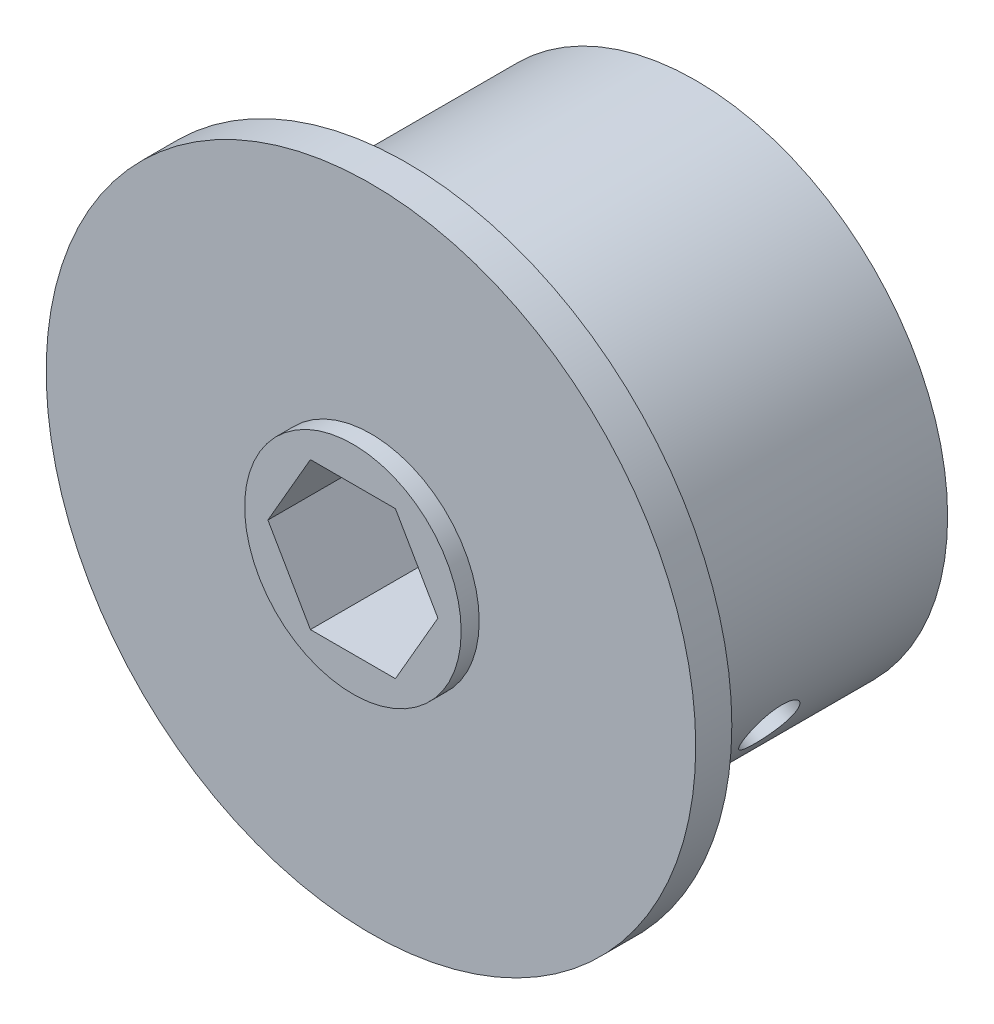
ISO-10303-21;
HEADER;
FILE_DESCRIPTION(('STEP AP214'),'2;1');
FILE_NAME('part.step','',(''),(''),'','','');
FILE_SCHEMA(('AUTOMOTIVE_DESIGN { 1 0 10303 214 1 1 1 1 }'));
ENDSEC;
DATA;
#1=APPLICATION_CONTEXT('core data for automotive mechanical design processes');
#2=APPLICATION_PROTOCOL_DEFINITION('international standard','automotive_design',2000,#1);
#3=PRODUCT_CONTEXT('',#1,'mechanical');
#4=PRODUCT('Part','Part','',(#3));
#5=PRODUCT_RELATED_PRODUCT_CATEGORY('part','',(#4));
#6=PRODUCT_DEFINITION_FORMATION('','',#4);
#7=PRODUCT_DEFINITION_CONTEXT('part definition',#1,'design');
#8=PRODUCT_DEFINITION('design','',#6,#7);
#9=PRODUCT_DEFINITION_SHAPE('','',#8);
#10=(LENGTH_UNIT() NAMED_UNIT(*) SI_UNIT(.MILLI.,.METRE.));
#11=(NAMED_UNIT(*) PLANE_ANGLE_UNIT() SI_UNIT($,.RADIAN.));
#12=(NAMED_UNIT(*) SI_UNIT($,.STERADIAN.) SOLID_ANGLE_UNIT());
#13=UNCERTAINTY_MEASURE_WITH_UNIT(LENGTH_MEASURE(1.E-05),#10,'distance_accuracy_value','');
#14=(GEOMETRIC_REPRESENTATION_CONTEXT(3) GLOBAL_UNCERTAINTY_ASSIGNED_CONTEXT((#13)) GLOBAL_UNIT_ASSIGNED_CONTEXT((#10,
#11,#12)) REPRESENTATION_CONTEXT('',''));
#15=CARTESIAN_POINT('',(0.,0.,0.));
#16=DIRECTION('',(0.,0.,1.));
#17=DIRECTION('',(1.,0.,0.));
#18=AXIS2_PLACEMENT_3D('',#15,#16,#17);
#19=CARTESIAN_POINT('',(0.,0.,15.875));
#20=DIRECTION('',(0.,0.,1.));
#21=DIRECTION('',(1.,0.,0.));
#22=AXIS2_PLACEMENT_3D('',#19,#20,#21);
#23=PLANE('',#22);
#24=CARTESIAN_POINT('',(0.,0.,15.875));
#25=DIRECTION('',(0.,0.,1.));
#26=DIRECTION('',(1.,0.,0.));
#27=AXIS2_PLACEMENT_3D('',#24,#25,#26);
#28=CIRCLE('',#27,28.575);
#29=CARTESIAN_POINT('',(28.575,0.,15.875));
#30=VERTEX_POINT('',#29);
#31=EDGE_CURVE('E159',#30,#30,#28,.T.);
#32=ORIENTED_EDGE('',*,*,#31,.T.);
#33=EDGE_LOOP('',(#32));
#34=FACE_BOUND('',#33,.T.);
#35=CARTESIAN_POINT('',(0.,0.,15.875));
#36=DIRECTION('',(0.,0.,1.));
#37=DIRECTION('',(1.,0.,0.));
#38=AXIS2_PLACEMENT_3D('',#35,#36,#37);
#39=CIRCLE('',#38,9.525);
#40=CARTESIAN_POINT('',(9.525,0.,15.875));
#41=VERTEX_POINT('',#40);
#42=EDGE_CURVE('E146',#41,#41,#39,.T.);
#43=ORIENTED_EDGE('',*,*,#42,.F.);
#44=EDGE_LOOP('',(#43));
#45=FACE_BOUND('',#44,.T.);
#46=ADVANCED_FACE('F45',(#34,#45),#23,.T.);
#47=CARTESIAN_POINT('',(0.,0.,12.7));
#48=DIRECTION('',(0.,0.,-1.));
#49=DIRECTION('',(-1.,0.,0.));
#50=AXIS2_PLACEMENT_3D('',#47,#48,#49);
#51=CYLINDRICAL_SURFACE('',#50,22.1615);
#52=CARTESIAN_POINT('',(-17.8718158307409,13.1045900798948,0.));
#53=CARTESIAN_POINT('',(-17.871820224846,13.1045858973804,0.135107549877782));
#54=CARTESIAN_POINT('',(-17.8785966118391,13.0953580559295,0.270302822316726));
#55=CARTESIAN_POINT('',(-17.9054350823029,13.0586359921838,0.536940361540157));
#56=CARTESIAN_POINT('',(-17.925511556838,13.0311219836436,0.668378402017896));
#57=CARTESIAN_POINT('',(-17.9780890483062,12.9584873362586,0.923601833752717));
#58=CARTESIAN_POINT('',(-18.0105822359077,12.9133777918696,1.0473919903435));
#59=CARTESIAN_POINT('',(-18.0866482871833,12.8066198281334,1.28390635191414));
#60=CARTESIAN_POINT('',(-18.1302190517812,12.744974542001,1.39663264776811));
#61=CARTESIAN_POINT('',(-18.2269004230544,12.6063211337034,1.60832770286021));
#62=CARTESIAN_POINT('',(-18.2800467920555,12.5292552963364,1.70724233332941));
#63=CARTESIAN_POINT('',(-18.3937344749281,12.3617490344331,1.88803961510108));
#64=CARTESIAN_POINT('',(-18.4542761364789,12.2713079810378,1.969921465142));
#65=CARTESIAN_POINT('',(-18.5806953560517,12.079035251207,2.11451866753716));
#66=CARTESIAN_POINT('',(-18.6465858477198,11.9771757236898,2.17718569964955));
#67=CARTESIAN_POINT('',(-18.7812587703655,11.7648708656253,2.28126514399162));
#68=CARTESIAN_POINT('',(-18.8500411186744,11.6544257804351,2.32267816335873));
#69=CARTESIAN_POINT('',(-18.9879404504429,11.4283704133736,2.38291412633372));
#70=CARTESIAN_POINT('',(-19.0570550088438,11.3127824636263,2.40182641504861));
#71=CARTESIAN_POINT('',(-19.1937628328722,11.0792532508907,2.41680066372596));
#72=CARTESIAN_POINT('',(-19.2613561446291,10.9613120594662,2.41286331750833));
#73=CARTESIAN_POINT('',(-19.3928372798855,10.7269718737099,2.3823222819212));
#74=CARTESIAN_POINT('',(-19.4567395858153,10.6105684631306,2.3558146695425));
#75=CARTESIAN_POINT('',(-19.5795492739872,10.3822036514942,2.28103540042261));
#76=CARTESIAN_POINT('',(-19.6384565811452,10.2702423172232,2.2327634165917));
#77=CARTESIAN_POINT('',(-19.7501005172439,10.0538787914519,2.11572137603471));
#78=CARTESIAN_POINT('',(-19.8028241264533,9.94949271963546,2.04690911407633));
#79=CARTESIAN_POINT('',(-19.9009660072967,9.75170973158794,1.89077050611883));
#80=CARTESIAN_POINT('',(-19.9463840246077,9.65831319795614,1.80344351582841));
#81=CARTESIAN_POINT('',(-20.0294021553203,9.48495843366156,1.61221473089836));
#82=CARTESIAN_POINT('',(-20.0669604916729,9.40507242658334,1.50822930545273));
#83=CARTESIAN_POINT('',(-20.1334441963845,9.26189818819076,1.28692448490394));
#84=CARTESIAN_POINT('',(-20.1623695480892,9.19860998889578,1.16960506407835));
#85=CARTESIAN_POINT('',(-20.2112510284752,9.09070630640858,0.924895031489563));
#86=CARTESIAN_POINT('',(-20.2312047004873,9.04609593790138,0.797501672446385));
#87=CARTESIAN_POINT('',(-20.2619188416526,8.97709120619611,0.536293961694688));
#88=CARTESIAN_POINT('',(-20.272679644183,8.95269610989702,0.40247984301936));
#89=CARTESIAN_POINT('',(-20.2848718006579,8.92503724088286,0.132963039345574));
#90=CARTESIAN_POINT('',(-20.2863506674362,8.92166585154537,-0.00272645838644722));
#91=CARTESIAN_POINT('',(-20.2800915852448,8.93588414825553,-0.272786213180352));
#92=CARTESIAN_POINT('',(-20.2723537844022,8.95347349742916,-0.407156491409298));
#93=CARTESIAN_POINT('',(-20.2477672412533,9.00893505841533,-0.670419468304693));
#94=CARTESIAN_POINT('',(-20.230941455606,9.04675616160307,-0.799325089854127));
#95=CARTESIAN_POINT('',(-20.1883643859492,9.14137305250932,-1.04840214166004));
#96=CARTESIAN_POINT('',(-20.1626128609769,9.19816935248866,-1.16857333601232));
#97=CARTESIAN_POINT('',(-20.1023511356681,9.32913491108898,-1.39730210235461));
#98=CARTESIAN_POINT('',(-20.0678060732033,9.40337322647373,-1.50581094492649));
#99=CARTESIAN_POINT('',(-19.9904551269609,9.56670949950874,-1.7076396845117));
#100=CARTESIAN_POINT('',(-19.9476490003849,9.65580789389695,-1.80095913494923));
#101=CARTESIAN_POINT('',(-19.8542241961788,9.84647964026446,-1.97016589899839));
#102=CARTESIAN_POINT('',(-19.8035727988573,9.94810485691146,-2.04597673171678));
#103=CARTESIAN_POINT('',(-19.6955081441473,10.1603742915641,-2.17748702631499));
#104=CARTESIAN_POINT('',(-19.6380949941923,10.271018366266,-2.2331868076701));
#105=CARTESIAN_POINT('',(-19.5178497746033,10.4977157885511,-2.32276537992922));
#106=CARTESIAN_POINT('',(-19.4550293258044,10.6137573012658,-2.35668970317208));
#107=CARTESIAN_POINT('',(-19.3253957058265,10.8479985301571,-2.40190282519144));
#108=CARTESIAN_POINT('',(-19.2585826692569,10.9661981734795,-2.41319238665199));
#109=CARTESIAN_POINT('',(-19.123144810793,11.2006988831251,-2.41280363936898));
#110=CARTESIAN_POINT('',(-19.0545311436458,11.3170066062795,-2.40124379081666));
#111=CARTESIAN_POINT('',(-18.9172048600835,11.545092900631,-2.35573359220399));
#112=CARTESIAN_POINT('',(-18.8484922436332,11.6568714702153,-2.32178323417059));
#113=CARTESIAN_POINT('',(-18.7131833395852,11.8728726077814,-2.23249006021187));
#114=CARTESIAN_POINT('',(-18.6465866378331,11.9770966596136,-2.17715145893857));
#115=CARTESIAN_POINT('',(-18.5177558412525,12.1753354561273,-2.04666506564997));
#116=CARTESIAN_POINT('',(-18.4555217468058,12.2693501999157,-1.97151727190178));
#117=CARTESIAN_POINT('',(-18.337340641937,12.4452933685969,-1.80310303595968));
#118=CARTESIAN_POINT('',(-18.2814264446352,12.5271593474157,-1.70974832716643));
#119=CARTESIAN_POINT('',(-18.1783404761937,12.6762873432931,-1.50774865998014));
#120=CARTESIAN_POINT('',(-18.1311707961315,12.7435458679271,-1.39910005525543));
#121=CARTESIAN_POINT('',(-18.0473245224273,12.8620161378904,-1.1692369717526));
#122=CARTESIAN_POINT('',(-18.0106794664028,12.9131796965381,-1.04798617820925));
#123=CARTESIAN_POINT('',(-17.9496145143314,12.9979296180732,-0.796695678988488));
#124=CARTESIAN_POINT('',(-17.9251809921214,13.0315355744092,-0.666665954031007));
#125=CARTESIAN_POINT('',(-17.8955773692263,13.0721371319264,-0.446600006434227));
#126=CARTESIAN_POINT('',(-17.8866840115806,13.0842928641542,-0.357964940148138));
#127=CARTESIAN_POINT('',(-17.874801797439,13.1005207070254,-0.179566163665263));
#128=CARTESIAN_POINT('',(-17.871812910094,13.1045928599029,-0.0898024593677152));
#129=CARTESIAN_POINT('',(-17.8718158307409,13.1045900798948,0.));
#130=B_SPLINE_CURVE_WITH_KNOTS('',3,(#52,#53,#54,#55,#56,#57,#58,#59,#60,#61,#62,#63,#64,#65,
#66,#67,#68,#69,#70,#71,#72,#73,#74,#75,#76,#77,#78,#79,#80,#81,#82,#83,#84,#85,#86,#87,#88,#89,
#90,#91,#92,#93,#94,#95,#96,#97,#98,#99,#100,#101,#102,#103,#104,#105,#106,#107,#108,#109,#110,
#111,#112,#113,#114,#115,#116,#117,#118,#119,#120,#121,#122,#123,#124,#125,#126,#127,#128,#129),
.UNSPECIFIED.,.T.,.F.,(4,2,2,2,2,2,2,2,2,2,2,2,2,2,2,2,2,2,2,2,2,2,2,2,2,2,2,2,2,2,2,2,2,2,2,2,
2,2,4),(0.,0.4049946688639,0.810428270531388,1.21560664763094,1.62070830514336,2.02735551202382,
2.43402184420944,2.84170260350582,3.24937171643548,3.65541661036258,4.06144917496549,
4.46576193389737,4.87008076931807,5.27523616750482,5.68040566694918,6.087676957091,
6.49494903290765,6.90233256214509,7.30970131708985,7.71498310036299,8.12025837017013,
8.52451465181874,8.92878184778895,9.33467743188275,9.74058494735677,10.1482333511529,
10.5558752789414,10.9626620293076,11.3694350726605,11.7741047778957,12.1787746272298,
12.5833647751253,12.987954958414,13.3945576582678,13.8012574640118,14.2091635475721,
14.6166134497753,14.8858042340675,15.1549936119201),.UNSPECIFIED.);
#131=CARTESIAN_POINT('',(-17.8718158307409,13.1045900798948,0.));
#132=VERTEX_POINT('',#131);
#133=EDGE_CURVE('E257',#132,#132,#130,.T.);
#134=ORIENTED_EDGE('',*,*,#133,.T.);
#135=EDGE_LOOP('',(#134));
#136=FACE_BOUND('',#135,.T.);
#137=CARTESIAN_POINT('',(17.8718158307409,-13.1045900798948,0.));
#138=CARTESIAN_POINT('',(17.8718202248461,-13.1045858973804,0.135107549877782));
#139=CARTESIAN_POINT('',(17.8785966118392,-13.0953580559295,0.270302822316726));
#140=CARTESIAN_POINT('',(17.9054350823029,-13.0586359921838,0.536940361540157));
#141=CARTESIAN_POINT('',(17.925511556838,-13.0311219836436,0.668378402017897));
#142=CARTESIAN_POINT('',(17.9780890483062,-12.9584873362586,0.923601833752718));
#143=CARTESIAN_POINT('',(18.0105822359078,-12.9133777918696,1.0473919903435));
#144=CARTESIAN_POINT('',(18.0866482871833,-12.8066198281333,1.28390635191414));
#145=CARTESIAN_POINT('',(18.1302190517813,-12.744974542001,1.39663264776811));
#146=CARTESIAN_POINT('',(18.2269004230544,-12.6063211337034,1.60832770286021));
#147=CARTESIAN_POINT('',(18.2800467920555,-12.5292552963364,1.70724233332941));
#148=CARTESIAN_POINT('',(18.3937344749281,-12.3617490344331,1.88803961510108));
#149=CARTESIAN_POINT('',(18.4542761364789,-12.2713079810378,1.969921465142));
#150=CARTESIAN_POINT('',(18.5806953560517,-12.079035251207,2.11451866753716));
#151=CARTESIAN_POINT('',(18.6465858477198,-11.9771757236897,2.17718569964955));
#152=CARTESIAN_POINT('',(18.7812587703655,-11.7648708656253,2.28126514399162));
#153=CARTESIAN_POINT('',(18.8500411186744,-11.6544257804351,2.32267816335873));
#154=CARTESIAN_POINT('',(18.9879404504429,-11.4283704133736,2.38291412633372));
#155=CARTESIAN_POINT('',(19.0570550088438,-11.3127824636262,2.40182641504861));
#156=CARTESIAN_POINT('',(19.1937628328722,-11.0792532508907,2.41680066372596));
#157=CARTESIAN_POINT('',(19.2613561446292,-10.9613120594661,2.41286331750833));
#158=CARTESIAN_POINT('',(19.3928372798855,-10.7269718737099,2.3823222819212));
#159=CARTESIAN_POINT('',(19.4567395858153,-10.6105684631306,2.3558146695425));
#160=CARTESIAN_POINT('',(19.5795492739872,-10.3822036514942,2.28103540042261));
#161=CARTESIAN_POINT('',(19.6384565811452,-10.2702423172232,2.2327634165917));
#162=CARTESIAN_POINT('',(19.7501005172439,-10.0538787914519,2.11572137603471));
#163=CARTESIAN_POINT('',(19.8028241264533,-9.94949271963543,2.04690911407633));
#164=CARTESIAN_POINT('',(19.9009660072967,-9.75170973158791,1.89077050611883));
#165=CARTESIAN_POINT('',(19.9463840246077,-9.65831319795611,1.80344351582841));
#166=CARTESIAN_POINT('',(20.0294021553203,-9.48495843366153,1.61221473089836));
#167=CARTESIAN_POINT('',(20.0669604916729,-9.40507242658332,1.50822930545273));
#168=CARTESIAN_POINT('',(20.1334441963845,-9.26189818819074,1.28692448490394));
#169=CARTESIAN_POINT('',(20.1623695480892,-9.19860998889576,1.16960506407835));
#170=CARTESIAN_POINT('',(20.2112510284752,-9.09070630640855,0.924895031489562));
#171=CARTESIAN_POINT('',(20.2312047004873,-9.04609593790135,0.797501672446385));
#172=CARTESIAN_POINT('',(20.2619188416526,-8.97709120619608,0.536293961694689));
#173=CARTESIAN_POINT('',(20.272679644183,-8.952696109897,0.40247984301936));
#174=CARTESIAN_POINT('',(20.2848718006579,-8.92503724088283,0.132963039345573));
#175=CARTESIAN_POINT('',(20.2863506674362,-8.92166585154535,-0.00272645838644782));
#176=CARTESIAN_POINT('',(20.2800915852448,-8.9358841482555,-0.272786213180353));
#177=CARTESIAN_POINT('',(20.2723537844022,-8.95347349742914,-0.4071564914093));
#178=CARTESIAN_POINT('',(20.2477672412534,-9.0089350584153,-0.670419468304695));
#179=CARTESIAN_POINT('',(20.230941455606,-9.04675616160305,-0.799325089854128));
#180=CARTESIAN_POINT('',(20.1883643859492,-9.1413730525093,-1.04840214166004));
#181=CARTESIAN_POINT('',(20.1626128609769,-9.19816935248864,-1.16857333601232));
#182=CARTESIAN_POINT('',(20.1023511356681,-9.32913491108896,-1.39730210235461));
#183=CARTESIAN_POINT('',(20.0678060732033,-9.4033732264737,-1.5058109449265));
#184=CARTESIAN_POINT('',(19.990455126961,-9.56670949950872,-1.7076396845117));
#185=CARTESIAN_POINT('',(19.9476490003849,-9.65580789389693,-1.80095913494923));
#186=CARTESIAN_POINT('',(19.8542241961788,-9.84647964026444,-1.97016589899839));
#187=CARTESIAN_POINT('',(19.8035727988573,-9.94810485691144,-2.04597673171678));
#188=CARTESIAN_POINT('',(19.6955081441473,-10.1603742915641,-2.17748702631499));
#189=CARTESIAN_POINT('',(19.6380949941923,-10.271018366266,-2.23318680767011));
#190=CARTESIAN_POINT('',(19.5178497746033,-10.497715788551,-2.32276537992922));
#191=CARTESIAN_POINT('',(19.4550293258044,-10.6137573012657,-2.35668970317208));
#192=CARTESIAN_POINT('',(19.3253957058265,-10.8479985301571,-2.40190282519144));
#193=CARTESIAN_POINT('',(19.2585826692569,-10.9661981734795,-2.41319238665199));
#194=CARTESIAN_POINT('',(19.1231448107931,-11.2006988831251,-2.41280363936898));
#195=CARTESIAN_POINT('',(19.0545311436458,-11.3170066062794,-2.40124379081666));
#196=CARTESIAN_POINT('',(18.9172048600835,-11.5450929006309,-2.35573359220399));
#197=CARTESIAN_POINT('',(18.8484922436332,-11.6568714702153,-2.32178323417059));
#198=CARTESIAN_POINT('',(18.7131833395852,-11.8728726077814,-2.23249006021187));
#199=CARTESIAN_POINT('',(18.6465866378331,-11.9770966596136,-2.17715145893856));
#200=CARTESIAN_POINT('',(18.5177558412525,-12.1753354561273,-2.04666506564996));
#201=CARTESIAN_POINT('',(18.4555217468058,-12.2693501999157,-1.97151727190178));
#202=CARTESIAN_POINT('',(18.337340641937,-12.4452933685969,-1.80310303595968));
#203=CARTESIAN_POINT('',(18.2814264446353,-12.5271593474157,-1.70974832716642));
#204=CARTESIAN_POINT('',(18.1783404761937,-12.6762873432931,-1.50774865998014));
#205=CARTESIAN_POINT('',(18.1311707961315,-12.7435458679271,-1.39910005525543));
#206=CARTESIAN_POINT('',(18.0473245224273,-12.8620161378904,-1.1692369717526));
#207=CARTESIAN_POINT('',(18.0106794664028,-12.9131796965381,-1.04798617820925));
#208=CARTESIAN_POINT('',(17.9496145143314,-12.9979296180732,-0.796695678988487));
#209=CARTESIAN_POINT('',(17.9251809921214,-13.0315355744092,-0.666665954031006));
#210=CARTESIAN_POINT('',(17.8955773692263,-13.0721371319264,-0.446600006434226));
#211=CARTESIAN_POINT('',(17.8866840115806,-13.0842928641542,-0.357964940148137));
#212=CARTESIAN_POINT('',(17.874801797439,-13.1005207070254,-0.179566163665262));
#213=CARTESIAN_POINT('',(17.871812910094,-13.1045928599029,-0.0898024593677147));
#214=CARTESIAN_POINT('',(17.8718158307409,-13.1045900798948,0.));
#215=B_SPLINE_CURVE_WITH_KNOTS('',3,(#137,#138,#139,#140,#141,#142,#143,#144,#145,#146,#147,
#148,#149,#150,#151,#152,#153,#154,#155,#156,#157,#158,#159,#160,#161,#162,#163,#164,#165,#166,
#167,#168,#169,#170,#171,#172,#173,#174,#175,#176,#177,#178,#179,#180,#181,#182,#183,#184,#185,
#186,#187,#188,#189,#190,#191,#192,#193,#194,#195,#196,#197,#198,#199,#200,#201,#202,#203,#204,
#205,#206,#207,#208,#209,#210,#211,#212,#213,#214),.UNSPECIFIED.,.T.,.F.,(4,2,2,2,2,2,2,2,2,2,2,
2,2,2,2,2,2,2,2,2,2,2,2,2,2,2,2,2,2,2,2,2,2,2,2,2,2,2,4),(0.,0.4049946688639,0.810428270531389,
1.21560664763095,1.62070830514336,2.02735551202382,2.43402184420944,2.84170260350582,
3.24937171643548,3.65541661036258,4.06144917496549,4.46576193389738,4.87008076931807,
5.27523616750482,5.68040566694918,6.08767695709101,6.49494903290765,6.90233256214509,
7.30970131708985,7.71498310036299,8.12025837017013,8.52451465181874,8.92878184778896,
9.33467743188276,9.74058494735677,10.1482333511529,10.5558752789414,10.9626620293076,
11.3694350726605,11.7741047778957,12.1787746272298,12.5833647751253,12.987954958414,
13.3945576582678,13.8012574640118,14.2091635475721,14.6166134497753,14.8858042340675,
15.1549936119201),.UNSPECIFIED.);
#216=CARTESIAN_POINT('',(17.8718158307409,-13.1045900798948,0.));
#217=VERTEX_POINT('',#216);
#218=EDGE_CURVE('E252',#217,#217,#215,.T.);
#219=ORIENTED_EDGE('',*,*,#218,.T.);
#220=EDGE_LOOP('',(#219));
#221=FACE_BOUND('',#220,.T.);
#222=CARTESIAN_POINT('',(0.,0.,12.7));
#223=DIRECTION('',(0.,0.,1.));
#224=DIRECTION('',(1.,0.,0.));
#225=AXIS2_PLACEMENT_3D('',#222,#223,#224);
#226=CIRCLE('',#225,22.1615);
#227=CARTESIAN_POINT('',(22.1615,0.,12.7));
#228=VERTEX_POINT('',#227);
#229=EDGE_CURVE('E11',#228,#228,#226,.T.);
#230=ORIENTED_EDGE('',*,*,#229,.F.);
#231=EDGE_LOOP('',(#230));
#232=FACE_BOUND('',#231,.T.);
#233=CARTESIAN_POINT('',(0.,0.,-12.7));
#234=DIRECTION('',(0.,0.,-1.));
#235=DIRECTION('',(-1.,0.,0.));
#236=AXIS2_PLACEMENT_3D('',#233,#234,#235);
#237=CIRCLE('',#236,22.1615);
#238=CARTESIAN_POINT('',(-22.1615,0.,-12.7));
#239=VERTEX_POINT('',#238);
#240=EDGE_CURVE('E151',#239,#239,#237,.T.);
#241=ORIENTED_EDGE('',*,*,#240,.F.);
#242=EDGE_LOOP('',(#241));
#243=FACE_BOUND('',#242,.T.);
#244=ADVANCED_FACE('F47',(#136,#221,#232,#243),#51,.T.);
#245=CARTESIAN_POINT('',(0.,0.,12.7));
#246=DIRECTION('',(0.,0.,1.));
#247=DIRECTION('',(1.,0.,0.));
#248=AXIS2_PLACEMENT_3D('',#245,#246,#247);
#249=PLANE('',#248);
#250=ORIENTED_EDGE('',*,*,#229,.T.);
#251=EDGE_LOOP('',(#250));
#252=FACE_BOUND('',#251,.T.);
#253=CARTESIAN_POINT('',(0.,0.,12.7));
#254=DIRECTION('',(0.,0.,1.));
#255=DIRECTION('',(1.,0.,0.));
#256=AXIS2_PLACEMENT_3D('',#253,#254,#255);
#257=CIRCLE('',#256,28.575);
#258=CARTESIAN_POINT('',(28.575,0.,12.7));
#259=VERTEX_POINT('',#258);
#260=EDGE_CURVE('E158',#259,#259,#257,.T.);
#261=ORIENTED_EDGE('',*,*,#260,.F.);
#262=EDGE_LOOP('',(#261));
#263=FACE_BOUND('',#262,.T.);
#264=ADVANCED_FACE('F221',(#252,#263),#249,.F.);
#265=CARTESIAN_POINT('',(0.,0.,15.875));
#266=DIRECTION('',(0.,0.,-1.));
#267=DIRECTION('',(-1.,0.,0.));
#268=AXIS2_PLACEMENT_3D('',#265,#266,#267);
#269=CYLINDRICAL_SURFACE('',#268,28.575);
#270=ORIENTED_EDGE('',*,*,#31,.F.);
#271=EDGE_LOOP('',(#270));
#272=FACE_BOUND('',#271,.T.);
#273=ORIENTED_EDGE('',*,*,#260,.T.);
#274=EDGE_LOOP('',(#273));
#275=FACE_BOUND('',#274,.T.);
#276=ADVANCED_FACE('F229',(#272,#275),#269,.T.);
#277=CARTESIAN_POINT('',(0.,0.,-12.7));
#278=DIRECTION('',(0.,0.,-1.));
#279=DIRECTION('',(-1.,0.,0.));
#280=AXIS2_PLACEMENT_3D('',#277,#278,#279);
#281=PLANE('',#280);
#282=CARTESIAN_POINT('',(0.,0.,-12.7));
#283=DIRECTION('',(0.,0.,-1.));
#284=DIRECTION('',(-1.,0.,0.));
#285=AXIS2_PLACEMENT_3D('',#282,#283,#284);
#286=CIRCLE('',#285,3.175);
#287=CARTESIAN_POINT('',(3.175,0.,-12.7));
#288=VERTEX_POINT('',#287);
#289=EDGE_CURVE('E50',#288,#288,#286,.T.);
#290=ORIENTED_EDGE('',*,*,#289,.F.);
#291=EDGE_LOOP('',(#290));
#292=FACE_BOUND('',#291,.T.);
#293=ORIENTED_EDGE('',*,*,#240,.T.);
#294=EDGE_LOOP('',(#293));
#295=FACE_BOUND('',#294,.T.);
#296=ADVANCED_FACE('F232',(#292,#295),#281,.T.);
#297=CARTESIAN_POINT('',(0.,0.,17.4625));
#298=DIRECTION('',(0.,0.,1.));
#299=DIRECTION('',(1.,0.,0.));
#300=AXIS2_PLACEMENT_3D('',#297,#298,#299);
#301=PLANE('',#300);
#302=CARTESIAN_POINT('',(0.,0.,17.4625));
#303=DIRECTION('',(0.,0.,1.));
#304=DIRECTION('',(1.,0.,0.));
#305=AXIS2_PLACEMENT_3D('',#302,#303,#304);
#306=CIRCLE('',#305,9.525);
#307=CARTESIAN_POINT('',(9.525,0.,17.4625));
#308=VERTEX_POINT('',#307);
#309=EDGE_CURVE('E147',#308,#308,#306,.T.);
#310=ORIENTED_EDGE('',*,*,#309,.T.);
#311=EDGE_LOOP('',(#310));
#312=FACE_BOUND('',#311,.T.);
#313=DIRECTION('',(-0.5,0.866025403784439,0.));
#314=VECTOR('',#313,1.);
#315=CARTESIAN_POINT('',(7.47899538708241,0.,17.4625));
#316=LINE('',#315,#314);
#317=CARTESIAN_POINT('',(7.47899538708241,0.,17.4625));
#318=VERTEX_POINT('',#317);
#319=CARTESIAN_POINT('',(3.73949769354121,6.477,17.4625));
#320=VERTEX_POINT('',#319);
#321=EDGE_CURVE('E108',#318,#320,#316,.T.);
#322=ORIENTED_EDGE('',*,*,#321,.F.);
#323=DIRECTION('',(0.5,0.866025403784439,0.));
#324=VECTOR('',#323,1.);
#325=CARTESIAN_POINT('',(3.73949769354121,-6.477,17.4625));
#326=LINE('',#325,#324);
#327=CARTESIAN_POINT('',(3.73949769354121,-6.477,17.4625));
#328=VERTEX_POINT('',#327);
#329=EDGE_CURVE('E118',#328,#318,#326,.T.);
#330=ORIENTED_EDGE('',*,*,#329,.F.);
#331=DIRECTION('',(1.,0.,0.));
#332=VECTOR('',#331,1.);
#333=CARTESIAN_POINT('',(-3.7394976935412,-6.477,17.4625));
#334=LINE('',#333,#332);
#335=CARTESIAN_POINT('',(-3.7394976935412,-6.477,17.4625));
#336=VERTEX_POINT('',#335);
#337=EDGE_CURVE('E143',#336,#328,#334,.T.);
#338=ORIENTED_EDGE('',*,*,#337,.F.);
#339=DIRECTION('',(0.5,-0.866025403784438,0.));
#340=VECTOR('',#339,1.);
#341=CARTESIAN_POINT('',(-7.47899538708241,0.,17.4625));
#342=LINE('',#341,#340);
#343=CARTESIAN_POINT('',(-7.47899538708241,0.,17.4625));
#344=VERTEX_POINT('',#343);
#345=EDGE_CURVE('E140',#344,#336,#342,.T.);
#346=ORIENTED_EDGE('',*,*,#345,.F.);
#347=DIRECTION('',(-0.5,-0.866025403784439,0.));
#348=VECTOR('',#347,1.);
#349=CARTESIAN_POINT('',(-3.73949769354121,6.477,17.4625));
#350=LINE('',#349,#348);
#351=CARTESIAN_POINT('',(-3.73949769354121,6.477,17.4625));
#352=VERTEX_POINT('',#351);
#353=EDGE_CURVE('E133',#352,#344,#350,.T.);
#354=ORIENTED_EDGE('',*,*,#353,.F.);
#355=DIRECTION('',(-1.,0.,0.));
#356=VECTOR('',#355,1.);
#357=CARTESIAN_POINT('',(3.73949769354121,6.477,17.4625));
#358=LINE('',#357,#356);
#359=EDGE_CURVE('E129',#320,#352,#358,.T.);
#360=ORIENTED_EDGE('',*,*,#359,.F.);
#361=EDGE_LOOP('',(#322,#330,#338,#346,#354,#360));
#362=FACE_BOUND('',#361,.T.);
#363=ADVANCED_FACE('F126',(#312,#362),#301,.T.);
#364=CARTESIAN_POINT('',(0.,0.,17.4625));
#365=DIRECTION('',(0.,0.,-1.));
#366=DIRECTION('',(-1.,0.,0.));
#367=AXIS2_PLACEMENT_3D('',#364,#365,#366);
#368=CYLINDRICAL_SURFACE('',#367,9.525);
#369=ORIENTED_EDGE('',*,*,#309,.F.);
#370=EDGE_LOOP('',(#369));
#371=FACE_BOUND('',#370,.T.);
#372=ORIENTED_EDGE('',*,*,#42,.T.);
#373=EDGE_LOOP('',(#372));
#374=FACE_BOUND('',#373,.T.);
#375=ADVANCED_FACE('F239',(#371,#374),#368,.T.);
#376=CARTESIAN_POINT('',(0.,0.,0.));
#377=DIRECTION('',(0.,0.,-1.));
#378=DIRECTION('',(-1.,0.,0.));
#379=AXIS2_PLACEMENT_3D('',#376,#377,#378);
#380=PLANE('',#379);
#381=CARTESIAN_POINT('',(0.,0.,0.));
#382=DIRECTION('',(0.,0.,1.));
#383=DIRECTION('',(1.,0.,0.));
#384=AXIS2_PLACEMENT_3D('',#381,#382,#383);
#385=CIRCLE('',#384,3.175);
#386=CARTESIAN_POINT('',(3.175,0.,0.));
#387=VERTEX_POINT('',#386);
#388=EDGE_CURVE('E249',#387,#387,#385,.T.);
#389=ORIENTED_EDGE('',*,*,#388,.F.);
#390=EDGE_LOOP('',(#389));
#391=FACE_BOUND('',#390,.T.);
#392=DIRECTION('',(1.,0.,0.));
#393=VECTOR('',#392,1.);
#394=CARTESIAN_POINT('',(-3.73949769354121,-6.47700000000001,0.));
#395=LINE('',#394,#393);
#396=CARTESIAN_POINT('',(-3.73949769354121,-6.47700000000001,0.));
#397=VERTEX_POINT('',#396);
#398=CARTESIAN_POINT('',(3.73949769354121,-6.47700000000001,0.));
#399=VERTEX_POINT('',#398);
#400=EDGE_CURVE('E179',#397,#399,#395,.T.);
#401=ORIENTED_EDGE('',*,*,#400,.T.);
#402=DIRECTION('',(0.5,0.866025403784439,0.));
#403=VECTOR('',#402,1.);
#404=CARTESIAN_POINT('',(3.73949769354121,-6.47700000000001,0.));
#405=LINE('',#404,#403);
#406=CARTESIAN_POINT('',(7.47899538708241,0.,0.));
#407=VERTEX_POINT('',#406);
#408=EDGE_CURVE('E163',#399,#407,#405,.T.);
#409=ORIENTED_EDGE('',*,*,#408,.T.);
#410=DIRECTION('',(-0.5,0.866025403784439,0.));
#411=VECTOR('',#410,1.);
#412=CARTESIAN_POINT('',(7.47899538708241,0.,0.));
#413=LINE('',#412,#411);
#414=CARTESIAN_POINT('',(3.7394976935412,6.47700000000001,0.));
#415=VERTEX_POINT('',#414);
#416=EDGE_CURVE('E111',#407,#415,#413,.T.);
#417=ORIENTED_EDGE('',*,*,#416,.T.);
#418=DIRECTION('',(-1.,0.,0.));
#419=VECTOR('',#418,1.);
#420=CARTESIAN_POINT('',(3.7394976935412,6.47700000000001,0.));
#421=LINE('',#420,#419);
#422=CARTESIAN_POINT('',(-3.73949769354121,6.47700000000001,0.));
#423=VERTEX_POINT('',#422);
#424=EDGE_CURVE('E171',#415,#423,#421,.T.);
#425=ORIENTED_EDGE('',*,*,#424,.T.);
#426=DIRECTION('',(-0.5,-0.866025403784439,0.));
#427=VECTOR('',#426,1.);
#428=CARTESIAN_POINT('',(-3.73949769354121,6.47700000000001,0.));
#429=LINE('',#428,#427);
#430=CARTESIAN_POINT('',(-7.47899538708242,0.,0.));
#431=VERTEX_POINT('',#430);
#432=EDGE_CURVE('E71',#423,#431,#429,.T.);
#433=ORIENTED_EDGE('',*,*,#432,.T.);
#434=DIRECTION('',(0.5,-0.866025403784439,0.));
#435=VECTOR('',#434,1.);
#436=CARTESIAN_POINT('',(-7.47899538708242,0.,0.));
#437=LINE('',#436,#435);
#438=EDGE_CURVE('E176',#431,#397,#437,.T.);
#439=ORIENTED_EDGE('',*,*,#438,.T.);
#440=EDGE_LOOP('',(#401,#409,#417,#425,#433,#439));
#441=FACE_BOUND('',#440,.T.);
#442=ADVANCED_FACE('F197',(#391,#441),#380,.F.);
#443=CARTESIAN_POINT('',(-3.73949769354121,-6.47700000000001,12.7));
#444=DIRECTION('',(0.,1.,0.));
#445=DIRECTION('',(0.,0.,1.));
#446=AXIS2_PLACEMENT_3D('',#443,#444,#445);
#447=PLANE('',#446);
#448=ORIENTED_EDGE('',*,*,#400,.F.);
#449=DIRECTION('',(0.,0.,-1.));
#450=VECTOR('',#449,1.);
#451=CARTESIAN_POINT('',(-3.73949769354121,-6.47700000000001,12.7));
#452=LINE('',#451,#450);
#453=EDGE_CURVE('E63',#336,#397,#452,.T.);
#454=ORIENTED_EDGE('',*,*,#453,.F.);
#455=ORIENTED_EDGE('',*,*,#337,.T.);
#456=DIRECTION('',(0.,0.,-1.));
#457=VECTOR('',#456,1.);
#458=CARTESIAN_POINT('',(3.73949769354121,-6.47700000000001,12.7));
#459=LINE('',#458,#457);
#460=EDGE_CURVE('E120',#328,#399,#459,.T.);
#461=ORIENTED_EDGE('',*,*,#460,.T.);
#462=EDGE_LOOP('',(#448,#454,#455,#461));
#463=FACE_BOUND('',#462,.T.);
#464=ADVANCED_FACE('F199',(#463),#447,.T.);
#465=CARTESIAN_POINT('',(-7.47899538708242,0.,12.7));
#466=DIRECTION('',(0.866025403784439,0.5,0.));
#467=DIRECTION('',(-0.5,0.866025403784439,0.));
#468=AXIS2_PLACEMENT_3D('',#465,#466,#467);
#469=PLANE('',#468);
#470=ORIENTED_EDGE('',*,*,#438,.F.);
#471=DIRECTION('',(0.,0.,-1.));
#472=VECTOR('',#471,1.);
#473=CARTESIAN_POINT('',(-7.47899538708242,0.,12.7));
#474=LINE('',#473,#472);
#475=EDGE_CURVE('E187',#344,#431,#474,.T.);
#476=ORIENTED_EDGE('',*,*,#475,.F.);
#477=ORIENTED_EDGE('',*,*,#345,.T.);
#478=ORIENTED_EDGE('',*,*,#453,.T.);
#479=EDGE_LOOP('',(#470,#476,#477,#478));
#480=FACE_BOUND('',#479,.T.);
#481=ADVANCED_FACE('F201',(#480),#469,.T.);
#482=CARTESIAN_POINT('',(-3.73949769354121,6.47700000000001,12.7));
#483=DIRECTION('',(0.866025403784439,-0.5,0.));
#484=DIRECTION('',(0.5,0.866025403784439,0.));
#485=AXIS2_PLACEMENT_3D('',#482,#483,#484);
#486=PLANE('',#485);
#487=ORIENTED_EDGE('',*,*,#475,.T.);
#488=ORIENTED_EDGE('',*,*,#432,.F.);
#489=DIRECTION('',(0.,0.,-1.));
#490=VECTOR('',#489,1.);
#491=CARTESIAN_POINT('',(-3.73949769354121,6.47700000000001,12.7));
#492=LINE('',#491,#490);
#493=EDGE_CURVE('E190',#352,#423,#492,.T.);
#494=ORIENTED_EDGE('',*,*,#493,.F.);
#495=ORIENTED_EDGE('',*,*,#353,.T.);
#496=EDGE_LOOP('',(#487,#488,#494,#495));
#497=FACE_BOUND('',#496,.T.);
#498=ADVANCED_FACE('F203',(#497),#486,.T.);
#499=CARTESIAN_POINT('',(3.7394976935412,6.47700000000001,12.7));
#500=DIRECTION('',(0.,-1.,0.));
#501=DIRECTION('',(1.,0.,0.));
#502=AXIS2_PLACEMENT_3D('',#499,#500,#501);
#503=PLANE('',#502);
#504=ORIENTED_EDGE('',*,*,#424,.F.);
#505=DIRECTION('',(0.,0.,-1.));
#506=VECTOR('',#505,1.);
#507=CARTESIAN_POINT('',(3.7394976935412,6.47700000000001,12.7));
#508=LINE('',#507,#506);
#509=EDGE_CURVE('E115',#320,#415,#508,.T.);
#510=ORIENTED_EDGE('',*,*,#509,.F.);
#511=ORIENTED_EDGE('',*,*,#359,.T.);
#512=ORIENTED_EDGE('',*,*,#493,.T.);
#513=EDGE_LOOP('',(#504,#510,#511,#512));
#514=FACE_BOUND('',#513,.T.);
#515=ADVANCED_FACE('F196',(#514),#503,.T.);
#516=CARTESIAN_POINT('',(7.47899538708241,0.,12.7));
#517=DIRECTION('',(-0.866025403784439,-0.5,0.));
#518=DIRECTION('',(0.5,-0.866025403784439,0.));
#519=AXIS2_PLACEMENT_3D('',#516,#517,#518);
#520=PLANE('',#519);
#521=ORIENTED_EDGE('',*,*,#416,.F.);
#522=DIRECTION('',(0.,0.,-1.));
#523=VECTOR('',#522,1.);
#524=CARTESIAN_POINT('',(7.47899538708241,0.,12.7));
#525=LINE('',#524,#523);
#526=EDGE_CURVE('E56',#318,#407,#525,.T.);
#527=ORIENTED_EDGE('',*,*,#526,.F.);
#528=ORIENTED_EDGE('',*,*,#321,.T.);
#529=ORIENTED_EDGE('',*,*,#509,.T.);
#530=EDGE_LOOP('',(#521,#527,#528,#529));
#531=FACE_BOUND('',#530,.T.);
#532=ADVANCED_FACE('F106',(#531),#520,.T.);
#533=CARTESIAN_POINT('',(3.73949769354121,-6.47700000000001,12.7));
#534=DIRECTION('',(-0.866025403784439,0.5,0.));
#535=DIRECTION('',(-0.5,-0.866025403784439,0.));
#536=AXIS2_PLACEMENT_3D('',#533,#534,#535);
#537=PLANE('',#536);
#538=ORIENTED_EDGE('',*,*,#526,.T.);
#539=ORIENTED_EDGE('',*,*,#408,.F.);
#540=ORIENTED_EDGE('',*,*,#460,.F.);
#541=ORIENTED_EDGE('',*,*,#329,.T.);
#542=EDGE_LOOP('',(#538,#539,#540,#541));
#543=FACE_BOUND('',#542,.T.);
#544=ADVANCED_FACE('F119',(#543),#537,.T.);
#545=CARTESIAN_POINT('',(0.,0.,-17.78));
#546=DIRECTION('',(0.,0.,1.));
#547=DIRECTION('',(1.,0.,0.));
#548=AXIS2_PLACEMENT_3D('',#545,#546,#547);
#549=CYLINDRICAL_SURFACE('',#548,3.175);
#550=CARTESIAN_POINT('',(3.175,0.,-12.7));
#551=CARTESIAN_POINT('',(3.175,0.,-12.5677083333333));
#552=CARTESIAN_POINT('',(3.175,0.,-12.4354166666667));
#553=CARTESIAN_POINT('',(3.175,0.,-12.1708333333333));
#554=CARTESIAN_POINT('',(3.175,0.,-12.0385416666667));
#555=CARTESIAN_POINT('',(3.175,0.,-11.7739583333333));
#556=CARTESIAN_POINT('',(3.175,0.,-11.6416666666667));
#557=CARTESIAN_POINT('',(3.175,0.,-11.3770833333333));
#558=CARTESIAN_POINT('',(3.175,0.,-11.2447916666667));
#559=CARTESIAN_POINT('',(3.175,0.,-10.9802083333333));
#560=CARTESIAN_POINT('',(3.175,0.,-10.8479166666667));
#561=CARTESIAN_POINT('',(3.175,0.,-10.5833333333333));
#562=CARTESIAN_POINT('',(3.175,0.,-10.4510416666667));
#563=CARTESIAN_POINT('',(3.175,0.,-10.1864583333333));
#564=CARTESIAN_POINT('',(3.175,0.,-10.0541666666667));
#565=CARTESIAN_POINT('',(3.175,0.,-9.78958333333333));
#566=CARTESIAN_POINT('',(3.175,0.,-9.65729166666666));
#567=CARTESIAN_POINT('',(3.175,0.,-9.39270833333333));
#568=CARTESIAN_POINT('',(3.175,0.,-9.26041666666666));
#569=CARTESIAN_POINT('',(3.175,0.,-8.99583333333333));
#570=CARTESIAN_POINT('',(3.175,0.,-8.86354166666666));
#571=CARTESIAN_POINT('',(3.175,0.,-8.59895833333333));
#572=CARTESIAN_POINT('',(3.175,0.,-8.46666666666667));
#573=CARTESIAN_POINT('',(3.175,0.,-8.20208333333333));
#574=CARTESIAN_POINT('',(3.175,0.,-8.06979166666667));
#575=CARTESIAN_POINT('',(3.175,0.,-7.80520833333333));
#576=CARTESIAN_POINT('',(3.175,0.,-7.67291666666667));
#577=CARTESIAN_POINT('',(3.175,0.,-7.40833333333333));
#578=CARTESIAN_POINT('',(3.175,0.,-7.27604166666667));
#579=CARTESIAN_POINT('',(3.175,0.,-7.01145833333333));
#580=CARTESIAN_POINT('',(3.175,0.,-6.87916666666666));
#581=CARTESIAN_POINT('',(3.175,0.,-6.61458333333333));
#582=CARTESIAN_POINT('',(3.175,0.,-6.48229166666667));
#583=CARTESIAN_POINT('',(3.175,0.,-6.21770833333333));
#584=CARTESIAN_POINT('',(3.175,0.,-6.08541666666667));
#585=CARTESIAN_POINT('',(3.175,0.,-5.82083333333333));
#586=CARTESIAN_POINT('',(3.175,0.,-5.68854166666667));
#587=CARTESIAN_POINT('',(3.175,0.,-5.42395833333333));
#588=CARTESIAN_POINT('',(3.175,0.,-5.29166666666667));
#589=CARTESIAN_POINT('',(3.175,0.,-5.02708333333333));
#590=CARTESIAN_POINT('',(3.175,0.,-4.89479166666667));
#591=CARTESIAN_POINT('',(3.175,0.,-4.63020833333333));
#592=CARTESIAN_POINT('',(3.175,0.,-4.49791666666667));
#593=CARTESIAN_POINT('',(3.175,0.,-4.23333333333333));
#594=CARTESIAN_POINT('',(3.175,0.,-4.10104166666667));
#595=CARTESIAN_POINT('',(3.175,0.,-3.83645833333333));
#596=CARTESIAN_POINT('',(3.175,0.,-3.70416666666667));
#597=CARTESIAN_POINT('',(3.175,0.,-3.43958333333333));
#598=CARTESIAN_POINT('',(3.175,0.,-3.30729166666667));
#599=CARTESIAN_POINT('',(3.175,0.,-3.04270833333333));
#600=CARTESIAN_POINT('',(3.175,0.,-2.91041666666667));
#601=CARTESIAN_POINT('',(3.175,0.,-2.64583333333333));
#602=CARTESIAN_POINT('',(3.175,0.,-2.51354166666667));
#603=CARTESIAN_POINT('',(3.175,0.,-2.24895833333333));
#604=CARTESIAN_POINT('',(3.175,0.,-2.11666666666667));
#605=CARTESIAN_POINT('',(3.175,0.,-1.85208333333333));
#606=CARTESIAN_POINT('',(3.175,0.,-1.71979166666667));
#607=CARTESIAN_POINT('',(3.175,0.,-1.45520833333333));
#608=CARTESIAN_POINT('',(3.175,0.,-1.32291666666667));
#609=CARTESIAN_POINT('',(3.175,0.,-1.05833333333333));
#610=CARTESIAN_POINT('',(3.175,0.,-0.926041666666666));
#611=CARTESIAN_POINT('',(3.175,0.,-0.661458333333332));
#612=CARTESIAN_POINT('',(3.175,0.,-0.529166666666665));
#613=CARTESIAN_POINT('',(3.175,0.,-0.264583333333332));
#614=CARTESIAN_POINT('',(3.175,0.,-0.132291666666666));
#615=CARTESIAN_POINT('',(3.175,0.,0.));
#616=B_SPLINE_CURVE_WITH_KNOTS('',3,(#550,#551,#552,#553,#554,#555,#556,#557,#558,#559,#560,
#561,#562,#563,#564,#565,#566,#567,#568,#569,#570,#571,#572,#573,#574,#575,#576,#577,#578,#579,
#580,#581,#582,#583,#584,#585,#586,#587,#588,#589,#590,#591,#592,#593,#594,#595,#596,#597,#598,
#599,#600,#601,#602,#603,#604,#605,#606,#607,#608,#609,#610,#611,#612,#613,#614,#615),
.UNSPECIFIED.,.F.,.F.,(4,2,2,2,2,2,2,2,2,2,2,2,2,2,2,2,2,2,2,2,2,2,2,2,2,2,2,2,2,2,2,2,4),(0.,
0.396875000000001,0.793750000000001,1.190625,1.5875,1.984375,2.38125,2.778125,3.175,3.571875,
3.96875,4.365625,4.7625,5.159375,5.55625,5.953125,6.35,6.746875,7.14375,7.540625,7.9375,
8.334375,8.73125,9.128125,9.525,9.921875,10.31875,10.715625,11.1125,11.509375,11.90625,
12.303125,12.7),.UNSPECIFIED.);
#617=EDGE_CURVE('BSEAM274',#288,#387,#616,.T.);
#618=ORIENTED_EDGE('',*,*,#289,.T.);
#619=ORIENTED_EDGE('',*,*,#388,.T.);
#620=ORIENTED_EDGE('',*,*,#617,.T.);
#621=ORIENTED_EDGE('',*,*,#617,.F.);
#622=EDGE_LOOP('',(#618,#620,#619,#621));
#623=FACE_BOUND('',#622,.T.);
#624=ADVANCED_FACE('F274',(#623),#549,.F.);
#625=CARTESIAN_POINT('',(24.0867645554566,-13.9065,0.));
#626=DIRECTION('',(-0.866025403784439,0.5,0.));
#627=DIRECTION('',(-0.5,-0.866025403784439,0.));
#628=AXIS2_PLACEMENT_3D('',#625,#626,#627);
#629=CYLINDRICAL_SURFACE('',#628,2.413);
#630=CARTESIAN_POINT('',(11.108507854343,-6.4135,0.));
#631=DIRECTION('',(0.866025403784439,-0.5,0.));
#632=DIRECTION('',(0.5,0.866025403784439,0.));
#633=AXIS2_PLACEMENT_3D('',#630,#631,#632);
#634=CIRCLE('',#633,2.413);
#635=CARTESIAN_POINT('',(12.315007854343,-4.32378070066815,0.));
#636=VERTEX_POINT('',#635);
#637=EDGE_CURVE('E446',#636,#636,#634,.T.);
#638=ORIENTED_EDGE('',*,*,#637,.F.);
#639=EDGE_LOOP('',(#638));
#640=FACE_BOUND('',#639,.T.);
#641=ORIENTED_EDGE('',*,*,#218,.F.);
#642=EDGE_LOOP('',(#641));
#643=FACE_BOUND('',#642,.T.);
#644=ADVANCED_FACE('F269',(#640,#643),#629,.F.);
#645=CARTESIAN_POINT('',(-25.4065872708241,14.6685,0.));
#646=DIRECTION('',(0.866025403784439,-0.5,0.));
#647=DIRECTION('',(0.5,0.866025403784439,0.));
#648=AXIS2_PLACEMENT_3D('',#645,#646,#647);
#649=CYLINDRICAL_SURFACE('',#648,2.413);
#650=CARTESIAN_POINT('',(-11.108507854343,6.41350000000001,0.));
#651=DIRECTION('',(-0.866025403784439,0.5,0.));
#652=DIRECTION('',(-0.5,-0.866025403784439,0.));
#653=AXIS2_PLACEMENT_3D('',#650,#651,#652);
#654=CIRCLE('',#653,2.41299999999999);
#655=CARTESIAN_POINT('',(-12.315007854343,4.32378070066816,0.));
#656=VERTEX_POINT('',#655);
#657=EDGE_CURVE('E448',#656,#656,#654,.T.);
#658=ORIENTED_EDGE('',*,*,#657,.F.);
#659=EDGE_LOOP('',(#658));
#660=FACE_BOUND('',#659,.T.);
#661=ORIENTED_EDGE('',*,*,#133,.F.);
#662=EDGE_LOOP('',(#661));
#663=FACE_BOUND('',#662,.T.);
#664=ADVANCED_FACE('F273',(#660,#663),#649,.F.);
#665=CARTESIAN_POINT('',(-11.108507854343,6.41350000000001,0.));
#666=DIRECTION('',(-0.866025403784439,0.5,0.));
#667=DIRECTION('',(-0.5,-0.866025403784439,0.));
#668=AXIS2_PLACEMENT_3D('',#665,#666,#667);
#669=PLANE('',#668);
#670=ORIENTED_EDGE('',*,*,#657,.T.);
#671=EDGE_LOOP('',(#670));
#672=FACE_BOUND('',#671,.T.);
#673=ADVANCED_FACE('F347',(#672),#669,.T.);
#674=CARTESIAN_POINT('',(11.108507854343,-6.4135,0.));
#675=DIRECTION('',(0.866025403784439,-0.5,0.));
#676=DIRECTION('',(0.5,0.866025403784439,0.));
#677=AXIS2_PLACEMENT_3D('',#674,#675,#676);
#678=PLANE('',#677);
#679=ORIENTED_EDGE('',*,*,#637,.T.);
#680=EDGE_LOOP('',(#679));
#681=FACE_BOUND('',#680,.T.);
#682=ADVANCED_FACE('F354',(#681),#678,.T.);
#683=CLOSED_SHELL('',(#46,#244,#264,#276,#296,#363,#375,#442,#464,#481,#498,#515,#532,#544,#624,
#644,#664,#673,#682));
#684=MANIFOLD_SOLID_BREP('B2',#683);
#685=ADVANCED_BREP_SHAPE_REPRESENTATION('',(#18,#684),#14);
#686=SHAPE_DEFINITION_REPRESENTATION(#9,#685);
ENDSEC;
END-ISO-10303-21;
